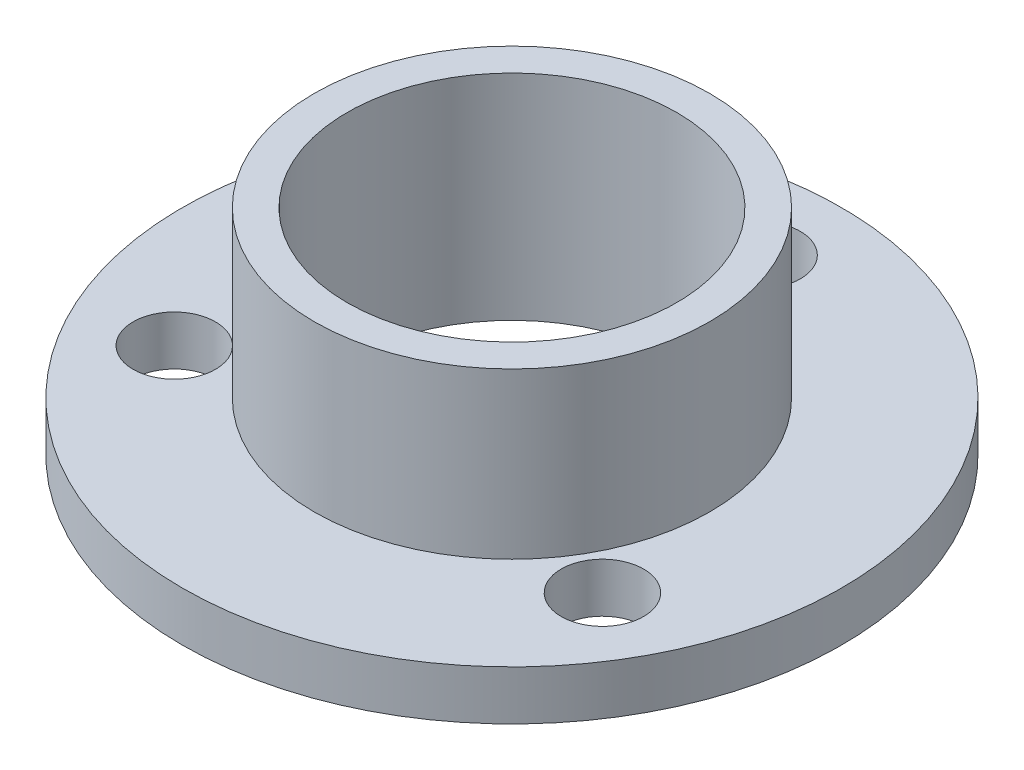
ISO-10303-21;
HEADER;
FILE_DESCRIPTION(('STEP AP214'),'2;1');
FILE_NAME('part.step','',(''),(''),'','','');
FILE_SCHEMA(('AUTOMOTIVE_DESIGN { 1 0 10303 214 1 1 1 1 }'));
ENDSEC;
DATA;
#1=APPLICATION_CONTEXT('core data for automotive mechanical design processes');
#2=APPLICATION_PROTOCOL_DEFINITION('international standard','automotive_design',2000,#1);
#3=PRODUCT_CONTEXT('',#1,'mechanical');
#4=PRODUCT('Part','Part','',(#3));
#5=PRODUCT_RELATED_PRODUCT_CATEGORY('part','',(#4));
#6=PRODUCT_DEFINITION_FORMATION('','',#4);
#7=PRODUCT_DEFINITION_CONTEXT('part definition',#1,'design');
#8=PRODUCT_DEFINITION('design','',#6,#7);
#9=PRODUCT_DEFINITION_SHAPE('','',#8);
#10=(LENGTH_UNIT() NAMED_UNIT(*) SI_UNIT(.MILLI.,.METRE.));
#11=(NAMED_UNIT(*) PLANE_ANGLE_UNIT() SI_UNIT($,.RADIAN.));
#12=(NAMED_UNIT(*) SI_UNIT($,.STERADIAN.) SOLID_ANGLE_UNIT());
#13=UNCERTAINTY_MEASURE_WITH_UNIT(LENGTH_MEASURE(1.E-05),#10,'distance_accuracy_value','');
#14=(GEOMETRIC_REPRESENTATION_CONTEXT(3) GLOBAL_UNCERTAINTY_ASSIGNED_CONTEXT((#13)) GLOBAL_UNIT_ASSIGNED_CONTEXT((#10,
#11,#12)) REPRESENTATION_CONTEXT('',''));
#15=CARTESIAN_POINT('',(0.,0.,0.));
#16=DIRECTION('',(0.,0.,1.));
#17=DIRECTION('',(1.,0.,0.));
#18=AXIS2_PLACEMENT_3D('',#15,#16,#17);
#19=CARTESIAN_POINT('',(0.,-3.,0.));
#20=DIRECTION('',(0.,1.,0.));
#21=DIRECTION('',(0.,0.,1.));
#22=AXIS2_PLACEMENT_3D('',#19,#20,#21);
#23=CYLINDRICAL_SURFACE('',#22,20.);
#24=CARTESIAN_POINT('',(0.,-3.,0.));
#25=DIRECTION('',(0.,1.,0.));
#26=DIRECTION('',(0.,0.,1.));
#27=AXIS2_PLACEMENT_3D('',#24,#25,#26);
#28=CIRCLE('',#27,20.);
#29=CARTESIAN_POINT('',(0.,-3.,20.));
#30=VERTEX_POINT('',#29);
#31=EDGE_CURVE('E50',#30,#30,#28,.T.);
#32=ORIENTED_EDGE('',*,*,#31,.T.);
#33=EDGE_LOOP('',(#32));
#34=FACE_BOUND('',#33,.T.);
#35=CARTESIAN_POINT('',(0.,0.,0.));
#36=DIRECTION('',(0.,1.,0.));
#37=DIRECTION('',(0.,0.,1.));
#38=AXIS2_PLACEMENT_3D('',#35,#36,#37);
#39=CIRCLE('',#38,20.);
#40=CARTESIAN_POINT('',(0.,0.,20.));
#41=VERTEX_POINT('',#40);
#42=EDGE_CURVE('E45',#41,#41,#39,.T.);
#43=ORIENTED_EDGE('',*,*,#42,.F.);
#44=EDGE_LOOP('',(#43));
#45=FACE_BOUND('',#44,.T.);
#46=ADVANCED_FACE('F41',(#34,#45),#23,.T.);
#47=CARTESIAN_POINT('',(1.03785587126485E-12,-3.,-14.9999999999995));
#48=DIRECTION('',(0.,1.,0.));
#49=DIRECTION('',(0.,0.,1.));
#50=AXIS2_PLACEMENT_3D('',#47,#48,#49);
#51=CYLINDRICAL_SURFACE('',#50,2.49999999999917);
#52=CARTESIAN_POINT('',(1.03785587126485E-12,-3.,-14.9999999999995));
#53=DIRECTION('',(0.,1.,0.));
#54=DIRECTION('',(0.,0.,1.));
#55=AXIS2_PLACEMENT_3D('',#52,#53,#54);
#56=CIRCLE('',#55,2.49999999999917);
#57=CARTESIAN_POINT('',(1.03785587126485E-12,-3.,-12.5000000000003));
#58=VERTEX_POINT('',#57);
#59=EDGE_CURVE('E56',#58,#58,#56,.T.);
#60=ORIENTED_EDGE('',*,*,#59,.F.);
#61=EDGE_LOOP('',(#60));
#62=FACE_BOUND('',#61,.T.);
#63=CARTESIAN_POINT('',(1.03785587126485E-12,0.,-14.9999999999995));
#64=DIRECTION('',(0.,1.,0.));
#65=DIRECTION('',(0.,0.,1.));
#66=AXIS2_PLACEMENT_3D('',#63,#64,#65);
#67=CIRCLE('',#66,2.49999999999917);
#68=CARTESIAN_POINT('',(1.03785587126485E-12,0.,-12.5000000000003));
#69=VERTEX_POINT('',#68);
#70=EDGE_CURVE('E68',#69,#69,#67,.T.);
#71=ORIENTED_EDGE('',*,*,#70,.T.);
#72=EDGE_LOOP('',(#71));
#73=FACE_BOUND('',#72,.T.);
#74=ADVANCED_FACE('F97',(#62,#73),#51,.F.);
#75=CARTESIAN_POINT('',(12.9903810567665,-3.,7.50000000000006));
#76=DIRECTION('',(0.,1.,0.));
#77=DIRECTION('',(0.,0.,1.));
#78=AXIS2_PLACEMENT_3D('',#75,#76,#77);
#79=CYLINDRICAL_SURFACE('',#78,2.5);
#80=CARTESIAN_POINT('',(12.9903810567665,-3.,7.50000000000006));
#81=DIRECTION('',(0.,1.,0.));
#82=DIRECTION('',(0.,0.,1.));
#83=AXIS2_PLACEMENT_3D('',#80,#81,#82);
#84=CIRCLE('',#83,2.5);
#85=CARTESIAN_POINT('',(12.9903810567665,-3.,10.0000000000001));
#86=VERTEX_POINT('',#85);
#87=EDGE_CURVE('E80',#86,#86,#84,.T.);
#88=ORIENTED_EDGE('',*,*,#87,.F.);
#89=EDGE_LOOP('',(#88));
#90=FACE_BOUND('',#89,.T.);
#91=CARTESIAN_POINT('',(12.9903810567665,0.,7.50000000000006));
#92=DIRECTION('',(0.,1.,0.));
#93=DIRECTION('',(0.,0.,1.));
#94=AXIS2_PLACEMENT_3D('',#91,#92,#93);
#95=CIRCLE('',#94,2.5);
#96=CARTESIAN_POINT('',(12.9903810567665,0.,10.0000000000001));
#97=VERTEX_POINT('',#96);
#98=EDGE_CURVE('E64',#97,#97,#95,.T.);
#99=ORIENTED_EDGE('',*,*,#98,.T.);
#100=EDGE_LOOP('',(#99));
#101=FACE_BOUND('',#100,.T.);
#102=ADVANCED_FACE('F99',(#90,#101),#79,.F.);
#103=CARTESIAN_POINT('',(-12.9903810567657,-3.,7.49999999999938));
#104=DIRECTION('',(0.,1.,0.));
#105=DIRECTION('',(0.,0.,1.));
#106=AXIS2_PLACEMENT_3D('',#103,#104,#105);
#107=CYLINDRICAL_SURFACE('',#106,2.50000000000038);
#108=CARTESIAN_POINT('',(-12.9903810567657,-3.,7.49999999999938));
#109=DIRECTION('',(0.,1.,0.));
#110=DIRECTION('',(0.,0.,1.));
#111=AXIS2_PLACEMENT_3D('',#108,#109,#110);
#112=CIRCLE('',#111,2.50000000000038);
#113=CARTESIAN_POINT('',(-12.9903810567657,-3.,9.99999999999977));
#114=VERTEX_POINT('',#113);
#115=EDGE_CURVE('E75',#114,#114,#112,.T.);
#116=ORIENTED_EDGE('',*,*,#115,.F.);
#117=EDGE_LOOP('',(#116));
#118=FACE_BOUND('',#117,.T.);
#119=CARTESIAN_POINT('',(-12.9903810567657,0.,7.49999999999938));
#120=DIRECTION('',(0.,1.,0.));
#121=DIRECTION('',(0.,0.,1.));
#122=AXIS2_PLACEMENT_3D('',#119,#120,#121);
#123=CIRCLE('',#122,2.50000000000038);
#124=CARTESIAN_POINT('',(-12.9903810567657,0.,9.99999999999977));
#125=VERTEX_POINT('',#124);
#126=EDGE_CURVE('E60',#125,#125,#123,.T.);
#127=ORIENTED_EDGE('',*,*,#126,.T.);
#128=EDGE_LOOP('',(#127));
#129=FACE_BOUND('',#128,.T.);
#130=ADVANCED_FACE('F43',(#118,#129),#107,.F.);
#131=CARTESIAN_POINT('',(0.,-3.,0.));
#132=DIRECTION('',(0.,1.,0.));
#133=DIRECTION('',(0.,0.,1.));
#134=AXIS2_PLACEMENT_3D('',#131,#132,#133);
#135=CYLINDRICAL_SURFACE('',#134,10.);
#136=CARTESIAN_POINT('',(0.,-3.,0.));
#137=DIRECTION('',(0.,1.,0.));
#138=DIRECTION('',(0.,0.,1.));
#139=AXIS2_PLACEMENT_3D('',#136,#137,#138);
#140=CIRCLE('',#139,10.);
#141=CARTESIAN_POINT('',(0.,-3.,10.));
#142=VERTEX_POINT('',#141);
#143=EDGE_CURVE('E10',#142,#142,#140,.T.);
#144=ORIENTED_EDGE('',*,*,#143,.F.);
#145=EDGE_LOOP('',(#144));
#146=FACE_BOUND('',#145,.T.);
#147=CARTESIAN_POINT('',(0.,10.,0.));
#148=DIRECTION('',(0.,1.,0.));
#149=DIRECTION('',(0.,0.,1.));
#150=AXIS2_PLACEMENT_3D('',#147,#148,#149);
#151=CIRCLE('',#150,10.);
#152=CARTESIAN_POINT('',(0.,10.,10.));
#153=VERTEX_POINT('',#152);
#154=EDGE_CURVE('E131',#153,#153,#151,.T.);
#155=ORIENTED_EDGE('',*,*,#154,.T.);
#156=EDGE_LOOP('',(#155));
#157=FACE_BOUND('',#156,.T.);
#158=ADVANCED_FACE('F109',(#146,#157),#135,.F.);
#159=CARTESIAN_POINT('',(0.,-3.,0.));
#160=DIRECTION('',(0.,1.,0.));
#161=DIRECTION('',(0.,0.,1.));
#162=AXIS2_PLACEMENT_3D('',#159,#160,#161);
#163=PLANE('',#162);
#164=ORIENTED_EDGE('',*,*,#115,.T.);
#165=EDGE_LOOP('',(#164));
#166=FACE_BOUND('',#165,.T.);
#167=ORIENTED_EDGE('',*,*,#87,.T.);
#168=EDGE_LOOP('',(#167));
#169=FACE_BOUND('',#168,.T.);
#170=ORIENTED_EDGE('',*,*,#59,.T.);
#171=EDGE_LOOP('',(#170));
#172=FACE_BOUND('',#171,.T.);
#173=ORIENTED_EDGE('',*,*,#31,.F.);
#174=EDGE_LOOP('',(#173));
#175=FACE_BOUND('',#174,.T.);
#176=ORIENTED_EDGE('',*,*,#143,.T.);
#177=EDGE_LOOP('',(#176));
#178=FACE_BOUND('',#177,.T.);
#179=ADVANCED_FACE('F94',(#166,#169,#172,#175,#178),#163,.F.);
#180=CARTESIAN_POINT('',(0.,0.,0.));
#181=DIRECTION('',(0.,1.,0.));
#182=DIRECTION('',(0.,0.,1.));
#183=AXIS2_PLACEMENT_3D('',#180,#181,#182);
#184=PLANE('',#183);
#185=CARTESIAN_POINT('',(0.,0.,0.));
#186=DIRECTION('',(0.,1.,0.));
#187=DIRECTION('',(0.,0.,1.));
#188=AXIS2_PLACEMENT_3D('',#185,#186,#187);
#189=CIRCLE('',#188,12.);
#190=CARTESIAN_POINT('',(0.,0.,12.));
#191=VERTEX_POINT('',#190);
#192=EDGE_CURVE('E88',#191,#191,#189,.T.);
#193=ORIENTED_EDGE('',*,*,#192,.F.);
#194=EDGE_LOOP('',(#193));
#195=FACE_BOUND('',#194,.T.);
#196=ORIENTED_EDGE('',*,*,#126,.F.);
#197=EDGE_LOOP('',(#196));
#198=FACE_BOUND('',#197,.T.);
#199=ORIENTED_EDGE('',*,*,#98,.F.);
#200=EDGE_LOOP('',(#199));
#201=FACE_BOUND('',#200,.T.);
#202=ORIENTED_EDGE('',*,*,#70,.F.);
#203=EDGE_LOOP('',(#202));
#204=FACE_BOUND('',#203,.T.);
#205=ORIENTED_EDGE('',*,*,#42,.T.);
#206=EDGE_LOOP('',(#205));
#207=FACE_BOUND('',#206,.T.);
#208=ADVANCED_FACE('F113',(#195,#198,#201,#204,#207),#184,.T.);
#209=CARTESIAN_POINT('',(0.,10.,0.));
#210=DIRECTION('',(0.,-1.,0.));
#211=DIRECTION('',(0.,0.,-1.));
#212=AXIS2_PLACEMENT_3D('',#209,#210,#211);
#213=CYLINDRICAL_SURFACE('',#212,12.);
#214=CARTESIAN_POINT('',(0.,10.,0.));
#215=DIRECTION('',(0.,1.,0.));
#216=DIRECTION('',(0.,0.,1.));
#217=AXIS2_PLACEMENT_3D('',#214,#215,#216);
#218=CIRCLE('',#217,12.);
#219=CARTESIAN_POINT('',(0.,10.,12.));
#220=VERTEX_POINT('',#219);
#221=EDGE_CURVE('E65',#220,#220,#218,.T.);
#222=ORIENTED_EDGE('',*,*,#221,.F.);
#223=EDGE_LOOP('',(#222));
#224=FACE_BOUND('',#223,.T.);
#225=ORIENTED_EDGE('',*,*,#192,.T.);
#226=EDGE_LOOP('',(#225));
#227=FACE_BOUND('',#226,.T.);
#228=ADVANCED_FACE('F116',(#224,#227),#213,.T.);
#229=CARTESIAN_POINT('',(0.,10.,0.));
#230=DIRECTION('',(0.,1.,0.));
#231=DIRECTION('',(0.,0.,1.));
#232=AXIS2_PLACEMENT_3D('',#229,#230,#231);
#233=PLANE('',#232);
#234=ORIENTED_EDGE('',*,*,#154,.F.);
#235=EDGE_LOOP('',(#234));
#236=FACE_BOUND('',#235,.T.);
#237=ORIENTED_EDGE('',*,*,#221,.T.);
#238=EDGE_LOOP('',(#237));
#239=FACE_BOUND('',#238,.T.);
#240=ADVANCED_FACE('F122',(#236,#239),#233,.T.);
#241=CLOSED_SHELL('',(#46,#74,#102,#130,#158,#179,#208,#228,#240));
#242=MANIFOLD_SOLID_BREP('B2',#241);
#243=ADVANCED_BREP_SHAPE_REPRESENTATION('',(#18,#242),#14);
#244=SHAPE_DEFINITION_REPRESENTATION(#9,#243);
ENDSEC;
END-ISO-10303-21;
